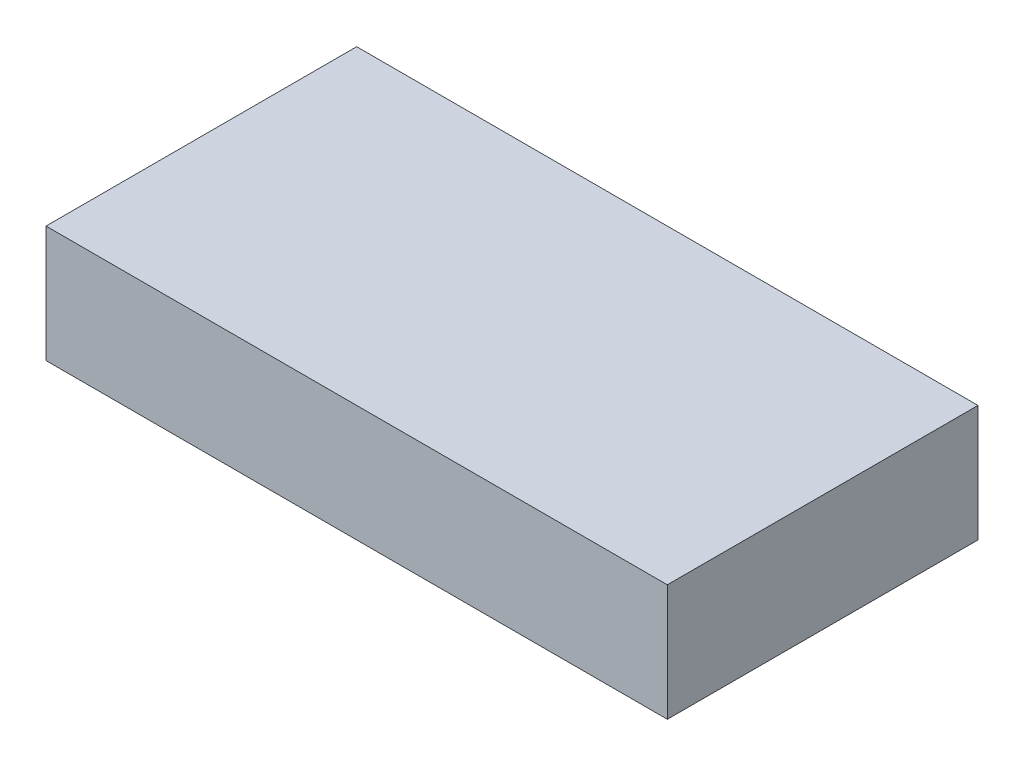
ISO-10303-21;
HEADER;
FILE_DESCRIPTION(('STEP AP214'),'2;1');
FILE_NAME('part.step','',(''),(''),'','','');
FILE_SCHEMA(('AUTOMOTIVE_DESIGN { 1 0 10303 214 1 1 1 1 }'));
ENDSEC;
DATA;
#1=APPLICATION_CONTEXT('core data for automotive mechanical design processes');
#2=APPLICATION_PROTOCOL_DEFINITION('international standard','automotive_design',2000,#1);
#3=PRODUCT_CONTEXT('',#1,'mechanical');
#4=PRODUCT('Part','Part','',(#3));
#5=PRODUCT_RELATED_PRODUCT_CATEGORY('part','',(#4));
#6=PRODUCT_DEFINITION_FORMATION('','',#4);
#7=PRODUCT_DEFINITION_CONTEXT('part definition',#1,'design');
#8=PRODUCT_DEFINITION('design','',#6,#7);
#9=PRODUCT_DEFINITION_SHAPE('','',#8);
#10=(LENGTH_UNIT() NAMED_UNIT(*) SI_UNIT(.MILLI.,.METRE.));
#11=(NAMED_UNIT(*) PLANE_ANGLE_UNIT() SI_UNIT($,.RADIAN.));
#12=(NAMED_UNIT(*) SI_UNIT($,.STERADIAN.) SOLID_ANGLE_UNIT());
#13=UNCERTAINTY_MEASURE_WITH_UNIT(LENGTH_MEASURE(1.E-05),#10,'distance_accuracy_value','');
#14=(GEOMETRIC_REPRESENTATION_CONTEXT(3) GLOBAL_UNCERTAINTY_ASSIGNED_CONTEXT((#13)) GLOBAL_UNIT_ASSIGNED_CONTEXT((#10,
#11,#12)) REPRESENTATION_CONTEXT('',''));
#15=CARTESIAN_POINT('',(0.,0.,0.));
#16=DIRECTION('',(0.,0.,1.));
#17=DIRECTION('',(1.,0.,0.));
#18=AXIS2_PLACEMENT_3D('',#15,#16,#17);
#19=CARTESIAN_POINT('',(-45.1303155006859,-6.85871056241427,80.));
#20=DIRECTION('',(0.,1.,0.));
#21=DIRECTION('',(0.,0.,1.));
#22=AXIS2_PLACEMENT_3D('',#19,#20,#21);
#23=PLANE('',#22);
#24=DIRECTION('',(1.,0.,0.));
#25=VECTOR('',#24,1.);
#26=CARTESIAN_POINT('',(-45.1303155006859,-6.85871056241427,0.));
#27=LINE('',#26,#25);
#28=CARTESIAN_POINT('',(-45.1303155006859,-6.85871056241427,0.));
#29=VERTEX_POINT('',#28);
#30=CARTESIAN_POINT('',(114.869684499314,-6.85871056241427,0.));
#31=VERTEX_POINT('',#30);
#32=EDGE_CURVE('E186',#29,#31,#27,.T.);
#33=ORIENTED_EDGE('',*,*,#32,.T.);
#34=DIRECTION('',(0.,0.,-1.));
#35=VECTOR('',#34,1.);
#36=CARTESIAN_POINT('',(114.869684499314,-6.85871056241427,80.));
#37=LINE('',#36,#35);
#38=CARTESIAN_POINT('',(114.869684499314,-6.85871056241427,80.));
#39=VERTEX_POINT('',#38);
#40=EDGE_CURVE('E49',#39,#31,#37,.T.);
#41=ORIENTED_EDGE('',*,*,#40,.F.);
#42=DIRECTION('',(1.,0.,0.));
#43=VECTOR('',#42,1.);
#44=CARTESIAN_POINT('',(-45.1303155006859,-6.85871056241427,80.));
#45=LINE('',#44,#43);
#46=CARTESIAN_POINT('',(-45.1303155006859,-6.85871056241427,80.));
#47=VERTEX_POINT('',#46);
#48=EDGE_CURVE('E93',#47,#39,#45,.T.);
#49=ORIENTED_EDGE('',*,*,#48,.F.);
#50=DIRECTION('',(0.,0.,-1.));
#51=VECTOR('',#50,1.);
#52=CARTESIAN_POINT('',(-45.1303155006859,-6.85871056241427,80.));
#53=LINE('',#52,#51);
#54=EDGE_CURVE('E11',#47,#29,#53,.T.);
#55=ORIENTED_EDGE('',*,*,#54,.T.);
#56=EDGE_LOOP('',(#33,#41,#49,#55));
#57=FACE_BOUND('',#56,.T.);
#58=DIRECTION('',(1.,0.,0.));
#59=VECTOR('',#58,1.);
#60=CARTESIAN_POINT('',(-45.1303155006859,-6.85871056241427,5.));
#61=LINE('',#60,#59);
#62=CARTESIAN_POINT('',(-40.1303155006859,-6.85871056241427,5.));
#63=VERTEX_POINT('',#62);
#64=CARTESIAN_POINT('',(109.869684499314,-6.85871056241427,5.));
#65=VERTEX_POINT('',#64);
#66=EDGE_CURVE('E140',#63,#65,#61,.T.);
#67=ORIENTED_EDGE('',*,*,#66,.F.);
#68=DIRECTION('',(0.,0.,-1.));
#69=VECTOR('',#68,1.);
#70=CARTESIAN_POINT('',(-40.1303155006859,-6.85871056241427,80.));
#71=LINE('',#70,#69);
#72=CARTESIAN_POINT('',(-40.1303155006859,-6.85871056241427,75.));
#73=VERTEX_POINT('',#72);
#74=EDGE_CURVE('E138',#73,#63,#71,.T.);
#75=ORIENTED_EDGE('',*,*,#74,.F.);
#76=DIRECTION('',(1.,0.,0.));
#77=VECTOR('',#76,1.);
#78=CARTESIAN_POINT('',(-45.1303155006859,-6.85871056241427,75.));
#79=LINE('',#78,#77);
#80=CARTESIAN_POINT('',(109.869684499314,-6.85871056241427,75.));
#81=VERTEX_POINT('',#80);
#82=EDGE_CURVE('E151',#73,#81,#79,.T.);
#83=ORIENTED_EDGE('',*,*,#82,.T.);
#84=DIRECTION('',(0.,0.,-1.));
#85=VECTOR('',#84,1.);
#86=CARTESIAN_POINT('',(109.869684499314,-6.85871056241427,80.));
#87=LINE('',#86,#85);
#88=EDGE_CURVE('E158',#81,#65,#87,.T.);
#89=ORIENTED_EDGE('',*,*,#88,.T.);
#90=EDGE_LOOP('',(#67,#75,#83,#89));
#91=FACE_BOUND('',#90,.T.);
#92=ADVANCED_FACE('F39',(#57,#91),#23,.F.);
#93=CARTESIAN_POINT('',(-45.1303155006859,23.1412894375857,80.));
#94=DIRECTION('',(1.,0.,0.));
#95=DIRECTION('',(0.,0.,-1.));
#96=AXIS2_PLACEMENT_3D('',#93,#94,#95);
#97=PLANE('',#96);
#98=DIRECTION('',(0.,-1.,0.));
#99=VECTOR('',#98,1.);
#100=CARTESIAN_POINT('',(-45.1303155006859,23.1412894375857,0.));
#101=LINE('',#100,#99);
#102=CARTESIAN_POINT('',(-45.1303155006859,23.1412894375857,0.));
#103=VERTEX_POINT('',#102);
#104=EDGE_CURVE('E164',#103,#29,#101,.T.);
#105=ORIENTED_EDGE('',*,*,#104,.T.);
#106=ORIENTED_EDGE('',*,*,#54,.F.);
#107=DIRECTION('',(0.,-1.,0.));
#108=VECTOR('',#107,1.);
#109=CARTESIAN_POINT('',(-45.1303155006859,23.1412894375857,80.));
#110=LINE('',#109,#108);
#111=CARTESIAN_POINT('',(-45.1303155006859,23.1412894375857,80.));
#112=VERTEX_POINT('',#111);
#113=EDGE_CURVE('E172',#112,#47,#110,.T.);
#114=ORIENTED_EDGE('',*,*,#113,.F.);
#115=DIRECTION('',(0.,0.,-1.));
#116=VECTOR('',#115,1.);
#117=CARTESIAN_POINT('',(-45.1303155006859,23.1412894375857,80.));
#118=LINE('',#117,#116);
#119=EDGE_CURVE('E182',#112,#103,#118,.T.);
#120=ORIENTED_EDGE('',*,*,#119,.T.);
#121=EDGE_LOOP('',(#105,#106,#114,#120));
#122=FACE_BOUND('',#121,.T.);
#123=ADVANCED_FACE('F41',(#122),#97,.F.);
#124=CARTESIAN_POINT('',(114.869684499314,23.1412894375857,80.));
#125=DIRECTION('',(-1.,0.,0.));
#126=DIRECTION('',(0.,0.,1.));
#127=AXIS2_PLACEMENT_3D('',#124,#125,#126);
#128=PLANE('',#127);
#129=DIRECTION('',(0.,1.,0.));
#130=VECTOR('',#129,1.);
#131=CARTESIAN_POINT('',(114.869684499314,23.1412894375857,0.));
#132=LINE('',#131,#130);
#133=CARTESIAN_POINT('',(114.869684499314,23.1412894375857,0.));
#134=VERTEX_POINT('',#133);
#135=EDGE_CURVE('E189',#31,#134,#132,.T.);
#136=ORIENTED_EDGE('',*,*,#135,.T.);
#137=DIRECTION('',(0.,0.,-1.));
#138=VECTOR('',#137,1.);
#139=CARTESIAN_POINT('',(114.869684499314,23.1412894375857,80.));
#140=LINE('',#139,#138);
#141=CARTESIAN_POINT('',(114.869684499314,23.1412894375857,80.));
#142=VERTEX_POINT('',#141);
#143=EDGE_CURVE('E196',#142,#134,#140,.T.);
#144=ORIENTED_EDGE('',*,*,#143,.F.);
#145=DIRECTION('',(0.,1.,0.));
#146=VECTOR('',#145,1.);
#147=CARTESIAN_POINT('',(114.869684499314,23.1412894375857,80.));
#148=LINE('',#147,#146);
#149=EDGE_CURVE('E177',#39,#142,#148,.T.);
#150=ORIENTED_EDGE('',*,*,#149,.F.);
#151=ORIENTED_EDGE('',*,*,#40,.T.);
#152=EDGE_LOOP('',(#136,#144,#150,#151));
#153=FACE_BOUND('',#152,.T.);
#154=ADVANCED_FACE('F204',(#153),#128,.F.);
#155=CARTESIAN_POINT('',(-45.1303155006859,23.1412894375857,80.));
#156=DIRECTION('',(0.,-1.,0.));
#157=DIRECTION('',(0.,0.,-1.));
#158=AXIS2_PLACEMENT_3D('',#155,#156,#157);
#159=PLANE('',#158);
#160=DIRECTION('',(-1.,0.,0.));
#161=VECTOR('',#160,1.);
#162=CARTESIAN_POINT('',(-45.1303155006859,23.1412894375857,0.));
#163=LINE('',#162,#161);
#164=EDGE_CURVE('E86',#134,#103,#163,.T.);
#165=ORIENTED_EDGE('',*,*,#164,.T.);
#166=ORIENTED_EDGE('',*,*,#119,.F.);
#167=DIRECTION('',(-1.,0.,0.));
#168=VECTOR('',#167,1.);
#169=CARTESIAN_POINT('',(-45.1303155006859,23.1412894375857,80.));
#170=LINE('',#169,#168);
#171=EDGE_CURVE('E65',#142,#112,#170,.T.);
#172=ORIENTED_EDGE('',*,*,#171,.F.);
#173=ORIENTED_EDGE('',*,*,#143,.T.);
#174=EDGE_LOOP('',(#165,#166,#172,#173));
#175=FACE_BOUND('',#174,.T.);
#176=ADVANCED_FACE('F212',(#175),#159,.F.);
#177=CARTESIAN_POINT('',(0.,0.,80.));
#178=DIRECTION('',(0.,0.,1.));
#179=DIRECTION('',(1.,0.,0.));
#180=AXIS2_PLACEMENT_3D('',#177,#178,#179);
#181=PLANE('',#180);
#182=ORIENTED_EDGE('',*,*,#113,.T.);
#183=ORIENTED_EDGE('',*,*,#48,.T.);
#184=ORIENTED_EDGE('',*,*,#149,.T.);
#185=ORIENTED_EDGE('',*,*,#171,.T.);
#186=EDGE_LOOP('',(#182,#183,#184,#185));
#187=FACE_BOUND('',#186,.T.);
#188=ADVANCED_FACE('F214',(#187),#181,.T.);
#189=CARTESIAN_POINT('',(0.,0.,0.));
#190=DIRECTION('',(0.,0.,1.));
#191=DIRECTION('',(1.,0.,0.));
#192=AXIS2_PLACEMENT_3D('',#189,#190,#191);
#193=PLANE('',#192);
#194=CARTESIAN_POINT('',(79.8696844993141,7.81447199125043,0.));
#195=DIRECTION('',(0.,0.,-1.));
#196=DIRECTION('',(-1.,0.,0.));
#197=AXIS2_PLACEMENT_3D('',#194,#195,#196);
#198=CIRCLE('',#197,4.17592014993846);
#199=CARTESIAN_POINT('',(75.6937643493757,7.81447199125043,0.));
#200=VERTEX_POINT('',#199);
#201=EDGE_CURVE('E253',#200,#200,#198,.T.);
#202=ORIENTED_EDGE('',*,*,#201,.F.);
#203=EDGE_LOOP('',(#202));
#204=FACE_BOUND('',#203,.T.);
#205=CARTESIAN_POINT('',(-30.1303155006859,7.81447199125043,0.));
#206=DIRECTION('',(0.,0.,-1.));
#207=DIRECTION('',(-1.,0.,0.));
#208=AXIS2_PLACEMENT_3D('',#205,#206,#207);
#209=CIRCLE('',#208,4.17592014993846);
#210=CARTESIAN_POINT('',(-34.3062356506243,7.81447199125043,0.));
#211=VERTEX_POINT('',#210);
#212=EDGE_CURVE('E146',#211,#211,#209,.T.);
#213=ORIENTED_EDGE('',*,*,#212,.F.);
#214=EDGE_LOOP('',(#213));
#215=FACE_BOUND('',#214,.T.);
#216=ORIENTED_EDGE('',*,*,#104,.F.);
#217=ORIENTED_EDGE('',*,*,#164,.F.);
#218=ORIENTED_EDGE('',*,*,#135,.F.);
#219=ORIENTED_EDGE('',*,*,#32,.F.);
#220=EDGE_LOOP('',(#216,#217,#218,#219));
#221=FACE_BOUND('',#220,.T.);
#222=ADVANCED_FACE('F208',(#204,#215,#221),#193,.F.);
#223=CARTESIAN_POINT('',(-40.1303155006859,23.1412894375857,80.));
#224=DIRECTION('',(1.,0.,0.));
#225=DIRECTION('',(0.,0.,-1.));
#226=AXIS2_PLACEMENT_3D('',#223,#224,#225);
#227=PLANE('',#226);
#228=DIRECTION('',(0.,-1.,0.));
#229=VECTOR('',#228,1.);
#230=CARTESIAN_POINT('',(-40.1303155006859,23.1412894375857,5.));
#231=LINE('',#230,#229);
#232=CARTESIAN_POINT('',(-40.1303155006859,18.1412894375857,5.));
#233=VERTEX_POINT('',#232);
#234=EDGE_CURVE('E120',#233,#63,#231,.T.);
#235=ORIENTED_EDGE('',*,*,#234,.F.);
#236=DIRECTION('',(0.,0.,-1.));
#237=VECTOR('',#236,1.);
#238=CARTESIAN_POINT('',(-40.1303155006859,18.1412894375857,80.));
#239=LINE('',#238,#237);
#240=CARTESIAN_POINT('',(-40.1303155006859,18.1412894375857,75.));
#241=VERTEX_POINT('',#240);
#242=EDGE_CURVE('E129',#241,#233,#239,.T.);
#243=ORIENTED_EDGE('',*,*,#242,.F.);
#244=DIRECTION('',(0.,-1.,0.));
#245=VECTOR('',#244,1.);
#246=CARTESIAN_POINT('',(-40.1303155006859,23.1412894375857,75.));
#247=LINE('',#246,#245);
#248=EDGE_CURVE('E56',#241,#73,#247,.T.);
#249=ORIENTED_EDGE('',*,*,#248,.T.);
#250=ORIENTED_EDGE('',*,*,#74,.T.);
#251=EDGE_LOOP('',(#235,#243,#249,#250));
#252=FACE_BOUND('',#251,.T.);
#253=ADVANCED_FACE('F136',(#252),#227,.T.);
#254=CARTESIAN_POINT('',(109.869684499314,23.1412894375857,80.));
#255=DIRECTION('',(-1.,0.,0.));
#256=DIRECTION('',(0.,0.,1.));
#257=AXIS2_PLACEMENT_3D('',#254,#255,#256);
#258=PLANE('',#257);
#259=DIRECTION('',(0.,1.,0.));
#260=VECTOR('',#259,1.);
#261=CARTESIAN_POINT('',(109.869684499314,23.1412894375857,5.));
#262=LINE('',#261,#260);
#263=CARTESIAN_POINT('',(109.869684499314,18.1412894375857,5.));
#264=VERTEX_POINT('',#263);
#265=EDGE_CURVE('E123',#65,#264,#262,.T.);
#266=ORIENTED_EDGE('',*,*,#265,.F.);
#267=ORIENTED_EDGE('',*,*,#88,.F.);
#268=DIRECTION('',(0.,1.,0.));
#269=VECTOR('',#268,1.);
#270=CARTESIAN_POINT('',(109.869684499314,23.1412894375857,75.));
#271=LINE('',#270,#269);
#272=CARTESIAN_POINT('',(109.869684499314,18.1412894375857,75.));
#273=VERTEX_POINT('',#272);
#274=EDGE_CURVE('E155',#81,#273,#271,.T.);
#275=ORIENTED_EDGE('',*,*,#274,.T.);
#276=DIRECTION('',(0.,0.,-1.));
#277=VECTOR('',#276,1.);
#278=CARTESIAN_POINT('',(109.869684499314,18.1412894375857,80.));
#279=LINE('',#278,#277);
#280=EDGE_CURVE('E134',#273,#264,#279,.T.);
#281=ORIENTED_EDGE('',*,*,#280,.T.);
#282=EDGE_LOOP('',(#266,#267,#275,#281));
#283=FACE_BOUND('',#282,.T.);
#284=ADVANCED_FACE('F229',(#283),#258,.T.);
#285=CARTESIAN_POINT('',(-45.1303155006859,18.1412894375857,80.));
#286=DIRECTION('',(0.,-1.,0.));
#287=DIRECTION('',(0.,0.,-1.));
#288=AXIS2_PLACEMENT_3D('',#285,#286,#287);
#289=PLANE('',#288);
#290=DIRECTION('',(-1.,0.,0.));
#291=VECTOR('',#290,1.);
#292=CARTESIAN_POINT('',(-45.1303155006859,18.1412894375857,5.));
#293=LINE('',#292,#291);
#294=EDGE_CURVE('E116',#264,#233,#293,.T.);
#295=ORIENTED_EDGE('',*,*,#294,.F.);
#296=ORIENTED_EDGE('',*,*,#280,.F.);
#297=DIRECTION('',(-1.,0.,0.));
#298=VECTOR('',#297,1.);
#299=CARTESIAN_POINT('',(-45.1303155006859,18.1412894375857,75.));
#300=LINE('',#299,#298);
#301=EDGE_CURVE('E132',#273,#241,#300,.T.);
#302=ORIENTED_EDGE('',*,*,#301,.T.);
#303=ORIENTED_EDGE('',*,*,#242,.T.);
#304=EDGE_LOOP('',(#295,#296,#302,#303));
#305=FACE_BOUND('',#304,.T.);
#306=ADVANCED_FACE('F130',(#305),#289,.T.);
#307=CARTESIAN_POINT('',(0.,0.,75.));
#308=DIRECTION('',(0.,0.,1.));
#309=DIRECTION('',(1.,0.,0.));
#310=AXIS2_PLACEMENT_3D('',#307,#308,#309);
#311=PLANE('',#310);
#312=ORIENTED_EDGE('',*,*,#248,.F.);
#313=ORIENTED_EDGE('',*,*,#301,.F.);
#314=ORIENTED_EDGE('',*,*,#274,.F.);
#315=ORIENTED_EDGE('',*,*,#82,.F.);
#316=EDGE_LOOP('',(#312,#313,#314,#315));
#317=FACE_BOUND('',#316,.T.);
#318=ADVANCED_FACE('F232',(#317),#311,.F.);
#319=CARTESIAN_POINT('',(0.,0.,5.));
#320=DIRECTION('',(0.,0.,1.));
#321=DIRECTION('',(1.,0.,0.));
#322=AXIS2_PLACEMENT_3D('',#319,#320,#321);
#323=PLANE('',#322);
#324=CARTESIAN_POINT('',(79.8696844993141,7.81447199125043,5.));
#325=DIRECTION('',(0.,0.,1.));
#326=DIRECTION('',(1.,0.,0.));
#327=AXIS2_PLACEMENT_3D('',#324,#325,#326);
#328=CIRCLE('',#327,4.17592014993846);
#329=CARTESIAN_POINT('',(84.0456046492526,7.81447199125043,5.));
#330=VERTEX_POINT('',#329);
#331=EDGE_CURVE('E259',#330,#330,#328,.T.);
#332=ORIENTED_EDGE('',*,*,#331,.F.);
#333=EDGE_LOOP('',(#332));
#334=FACE_BOUND('',#333,.T.);
#335=CARTESIAN_POINT('',(-30.1303155006859,7.81447199125043,5.));
#336=DIRECTION('',(0.,0.,1.));
#337=DIRECTION('',(1.,0.,0.));
#338=AXIS2_PLACEMENT_3D('',#335,#336,#337);
#339=CIRCLE('',#338,4.17592014993846);
#340=CARTESIAN_POINT('',(-25.9543953507474,7.81447199125043,5.));
#341=VERTEX_POINT('',#340);
#342=EDGE_CURVE('E43',#341,#341,#339,.T.);
#343=ORIENTED_EDGE('',*,*,#342,.F.);
#344=EDGE_LOOP('',(#343));
#345=FACE_BOUND('',#344,.T.);
#346=ORIENTED_EDGE('',*,*,#234,.T.);
#347=ORIENTED_EDGE('',*,*,#66,.T.);
#348=ORIENTED_EDGE('',*,*,#265,.T.);
#349=ORIENTED_EDGE('',*,*,#294,.T.);
#350=EDGE_LOOP('',(#346,#347,#348,#349));
#351=FACE_BOUND('',#350,.T.);
#352=ADVANCED_FACE('F118',(#334,#345,#351),#323,.T.);
#353=CARTESIAN_POINT('',(-30.1303155006859,7.81447199125043,15.));
#354=DIRECTION('',(0.,0.,-1.));
#355=DIRECTION('',(-1.,0.,0.));
#356=AXIS2_PLACEMENT_3D('',#353,#354,#355);
#357=CYLINDRICAL_SURFACE('',#356,4.17592014993846);
#358=ORIENTED_EDGE('',*,*,#342,.T.);
#359=EDGE_LOOP('',(#358));
#360=FACE_BOUND('',#359,.T.);
#361=ORIENTED_EDGE('',*,*,#212,.T.);
#362=EDGE_LOOP('',(#361));
#363=FACE_BOUND('',#362,.T.);
#364=ADVANCED_FACE('F239',(#360,#363),#357,.F.);
#365=CARTESIAN_POINT('',(79.8696844993141,7.81447199125043,15.));
#366=DIRECTION('',(0.,0.,-1.));
#367=DIRECTION('',(-1.,0.,0.));
#368=AXIS2_PLACEMENT_3D('',#365,#366,#367);
#369=CYLINDRICAL_SURFACE('',#368,4.17592014993846);
#370=ORIENTED_EDGE('',*,*,#331,.T.);
#371=EDGE_LOOP('',(#370));
#372=FACE_BOUND('',#371,.T.);
#373=ORIENTED_EDGE('',*,*,#201,.T.);
#374=EDGE_LOOP('',(#373));
#375=FACE_BOUND('',#374,.T.);
#376=ADVANCED_FACE('F266',(#372,#375),#369,.F.);
#377=CLOSED_SHELL('',(#92,#123,#154,#176,#188,#222,#253,#284,#306,#318,#352,#364,#376));
#378=MANIFOLD_SOLID_BREP('B2',#377);
#379=ADVANCED_BREP_SHAPE_REPRESENTATION('',(#18,#378),#14);
#380=SHAPE_DEFINITION_REPRESENTATION(#9,#379);
ENDSEC;
END-ISO-10303-21;
